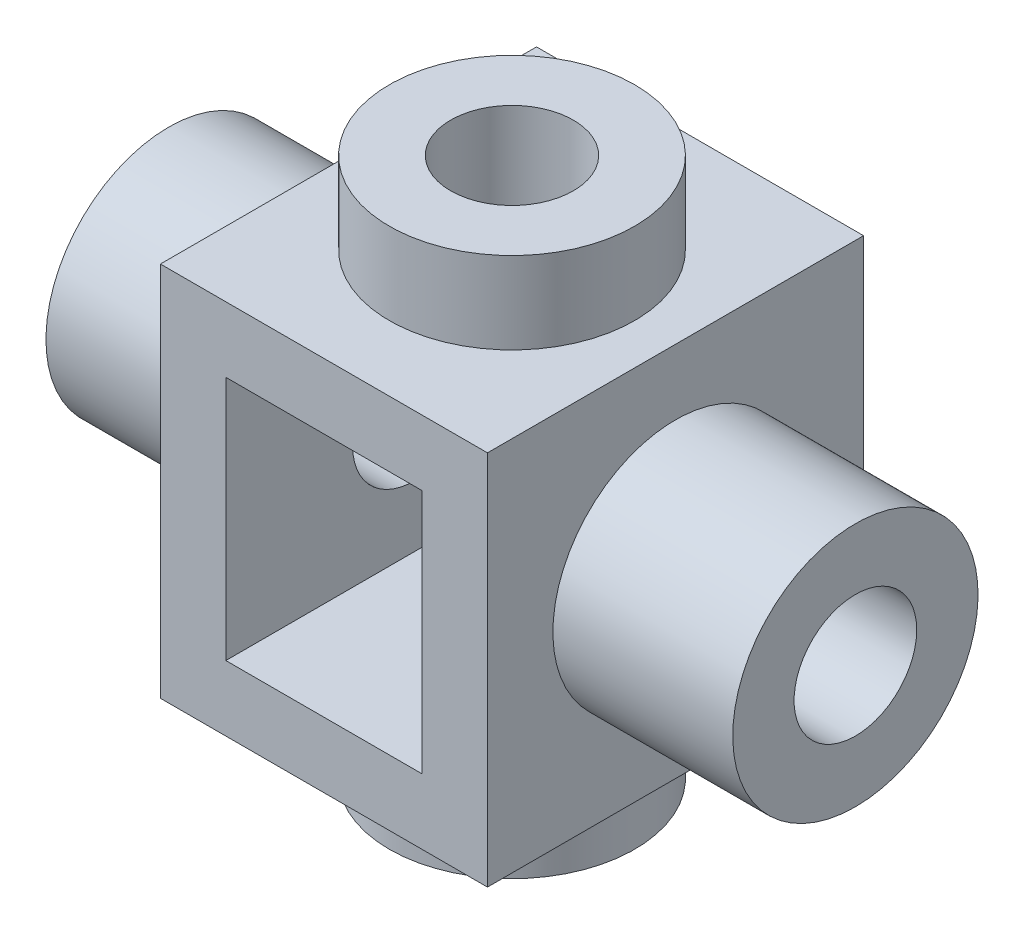
ISO-10303-21;
HEADER;
FILE_DESCRIPTION(('STEP AP214'),'2;1');
FILE_NAME('part.step','',(''),(''),'','','');
FILE_SCHEMA(('AUTOMOTIVE_DESIGN { 1 0 10303 214 1 1 1 1 }'));
ENDSEC;
DATA;
#1=APPLICATION_CONTEXT('core data for automotive mechanical design processes');
#2=APPLICATION_PROTOCOL_DEFINITION('international standard','automotive_design',2000,#1);
#3=PRODUCT_CONTEXT('',#1,'mechanical');
#4=PRODUCT('Part','Part','',(#3));
#5=PRODUCT_RELATED_PRODUCT_CATEGORY('part','',(#4));
#6=PRODUCT_DEFINITION_FORMATION('','',#4);
#7=PRODUCT_DEFINITION_CONTEXT('part definition',#1,'design');
#8=PRODUCT_DEFINITION('design','',#6,#7);
#9=PRODUCT_DEFINITION_SHAPE('','',#8);
#10=(LENGTH_UNIT() NAMED_UNIT(*) SI_UNIT(.MILLI.,.METRE.));
#11=(NAMED_UNIT(*) PLANE_ANGLE_UNIT() SI_UNIT($,.RADIAN.));
#12=(NAMED_UNIT(*) SI_UNIT($,.STERADIAN.) SOLID_ANGLE_UNIT());
#13=UNCERTAINTY_MEASURE_WITH_UNIT(LENGTH_MEASURE(1.E-05),#10,'distance_accuracy_value','');
#14=(GEOMETRIC_REPRESENTATION_CONTEXT(3) GLOBAL_UNCERTAINTY_ASSIGNED_CONTEXT((#13)) GLOBAL_UNIT_ASSIGNED_CONTEXT((#10,
#11,#12)) REPRESENTATION_CONTEXT('',''));
#15=CARTESIAN_POINT('',(0.,0.,0.));
#16=DIRECTION('',(0.,0.,1.));
#17=DIRECTION('',(1.,0.,0.));
#18=AXIS2_PLACEMENT_3D('',#15,#16,#17);
#19=CARTESIAN_POINT('',(20.,-23.,-46.));
#20=DIRECTION('',(0.,-1.,0.));
#21=DIRECTION('',(1.,0.,0.));
#22=AXIS2_PLACEMENT_3D('',#19,#20,#21);
#23=PLANE('',#22);
#24=CARTESIAN_POINT('',(0.,-23.,-23.));
#25=DIRECTION('',(0.,1.,0.));
#26=DIRECTION('',(0.,0.,1.));
#27=AXIS2_PLACEMENT_3D('',#24,#25,#26);
#28=CIRCLE('',#27,15.);
#29=CARTESIAN_POINT('',(0.,-23.,-8.));
#30=VERTEX_POINT('',#29);
#31=EDGE_CURVE('E197',#30,#30,#28,.T.);
#32=ORIENTED_EDGE('',*,*,#31,.T.);
#33=EDGE_LOOP('',(#32));
#34=FACE_BOUND('',#33,.T.);
#35=DIRECTION('',(0.,0.,1.));
#36=VECTOR('',#35,1.);
#37=CARTESIAN_POINT('',(-20.,-23.,-46.));
#38=LINE('',#37,#36);
#39=CARTESIAN_POINT('',(-20.,-23.,-46.));
#40=VERTEX_POINT('',#39);
#41=CARTESIAN_POINT('',(-20.,-23.,0.));
#42=VERTEX_POINT('',#41);
#43=EDGE_CURVE('E136',#40,#42,#38,.T.);
#44=ORIENTED_EDGE('',*,*,#43,.F.);
#45=DIRECTION('',(-1.,0.,0.));
#46=VECTOR('',#45,1.);
#47=CARTESIAN_POINT('',(20.,-23.,-46.));
#48=LINE('',#47,#46);
#49=CARTESIAN_POINT('',(20.,-23.,-46.));
#50=VERTEX_POINT('',#49);
#51=EDGE_CURVE('E11',#50,#40,#48,.T.);
#52=ORIENTED_EDGE('',*,*,#51,.F.);
#53=DIRECTION('',(0.,0.,1.));
#54=VECTOR('',#53,1.);
#55=CARTESIAN_POINT('',(20.,-23.,-46.));
#56=LINE('',#55,#54);
#57=CARTESIAN_POINT('',(20.,-23.,0.));
#58=VERTEX_POINT('',#57);
#59=EDGE_CURVE('E140',#50,#58,#56,.T.);
#60=ORIENTED_EDGE('',*,*,#59,.T.);
#61=DIRECTION('',(-1.,0.,0.));
#62=VECTOR('',#61,1.);
#63=CARTESIAN_POINT('',(20.,-23.,0.));
#64=LINE('',#63,#62);
#65=EDGE_CURVE('E38',#58,#42,#64,.T.);
#66=ORIENTED_EDGE('',*,*,#65,.T.);
#67=EDGE_LOOP('',(#44,#52,#60,#66));
#68=FACE_BOUND('',#67,.T.);
#69=ADVANCED_FACE('F35',(#34,#68),#23,.T.);
#70=CARTESIAN_POINT('',(20.,23.,-46.));
#71=DIRECTION('',(0.,0.,-1.));
#72=DIRECTION('',(-1.,0.,0.));
#73=AXIS2_PLACEMENT_3D('',#70,#71,#72);
#74=PLANE('',#73);
#75=DIRECTION('',(-1.,0.,0.));
#76=VECTOR('',#75,1.);
#77=CARTESIAN_POINT('',(12.,-15.,-46.));
#78=LINE('',#77,#76);
#79=CARTESIAN_POINT('',(12.,-15.,-46.));
#80=VERTEX_POINT('',#79);
#81=CARTESIAN_POINT('',(-12.,-15.,-46.));
#82=VERTEX_POINT('',#81);
#83=EDGE_CURVE('E51',#80,#82,#78,.T.);
#84=ORIENTED_EDGE('',*,*,#83,.F.);
#85=DIRECTION('',(0.,-1.,0.));
#86=VECTOR('',#85,1.);
#87=CARTESIAN_POINT('',(12.,15.,-46.));
#88=LINE('',#87,#86);
#89=CARTESIAN_POINT('',(12.,15.,-46.));
#90=VERTEX_POINT('',#89);
#91=EDGE_CURVE('E118',#90,#80,#88,.T.);
#92=ORIENTED_EDGE('',*,*,#91,.F.);
#93=DIRECTION('',(1.,0.,0.));
#94=VECTOR('',#93,1.);
#95=CARTESIAN_POINT('',(-12.,15.,-46.));
#96=LINE('',#95,#94);
#97=CARTESIAN_POINT('',(-12.,15.,-46.));
#98=VERTEX_POINT('',#97);
#99=EDGE_CURVE('E121',#98,#90,#96,.T.);
#100=ORIENTED_EDGE('',*,*,#99,.F.);
#101=DIRECTION('',(0.,1.,0.));
#102=VECTOR('',#101,1.);
#103=CARTESIAN_POINT('',(-12.,-15.,-46.));
#104=LINE('',#103,#102);
#105=EDGE_CURVE('E130',#82,#98,#104,.T.);
#106=ORIENTED_EDGE('',*,*,#105,.F.);
#107=EDGE_LOOP('',(#84,#92,#100,#106));
#108=FACE_BOUND('',#107,.T.);
#109=DIRECTION('',(0.,-1.,0.));
#110=VECTOR('',#109,1.);
#111=CARTESIAN_POINT('',(-20.,23.,-46.));
#112=LINE('',#111,#110);
#113=CARTESIAN_POINT('',(-20.,23.,-46.));
#114=VERTEX_POINT('',#113);
#115=EDGE_CURVE('E144',#114,#40,#112,.T.);
#116=ORIENTED_EDGE('',*,*,#115,.F.);
#117=DIRECTION('',(-1.,0.,0.));
#118=VECTOR('',#117,1.);
#119=CARTESIAN_POINT('',(20.,23.,-46.));
#120=LINE('',#119,#118);
#121=CARTESIAN_POINT('',(20.,23.,-46.));
#122=VERTEX_POINT('',#121);
#123=EDGE_CURVE('E43',#122,#114,#120,.T.);
#124=ORIENTED_EDGE('',*,*,#123,.F.);
#125=DIRECTION('',(0.,-1.,0.));
#126=VECTOR('',#125,1.);
#127=CARTESIAN_POINT('',(20.,23.,-46.));
#128=LINE('',#127,#126);
#129=EDGE_CURVE('E150',#122,#50,#128,.T.);
#130=ORIENTED_EDGE('',*,*,#129,.T.);
#131=ORIENTED_EDGE('',*,*,#51,.T.);
#132=EDGE_LOOP('',(#116,#124,#130,#131));
#133=FACE_BOUND('',#132,.T.);
#134=ADVANCED_FACE('F174',(#108,#133),#74,.T.);
#135=CARTESIAN_POINT('',(20.,23.,0.));
#136=DIRECTION('',(0.,1.,0.));
#137=DIRECTION('',(-1.,0.,0.));
#138=AXIS2_PLACEMENT_3D('',#135,#136,#137);
#139=PLANE('',#138);
#140=CARTESIAN_POINT('',(0.,23.,-23.));
#141=DIRECTION('',(0.,-1.,0.));
#142=DIRECTION('',(0.,0.,-1.));
#143=AXIS2_PLACEMENT_3D('',#140,#141,#142);
#144=CIRCLE('',#143,15.);
#145=CARTESIAN_POINT('',(0.,23.,-38.));
#146=VERTEX_POINT('',#145);
#147=EDGE_CURVE('E202',#146,#146,#144,.T.);
#148=ORIENTED_EDGE('',*,*,#147,.T.);
#149=EDGE_LOOP('',(#148));
#150=FACE_BOUND('',#149,.T.);
#151=DIRECTION('',(0.,0.,-1.));
#152=VECTOR('',#151,1.);
#153=CARTESIAN_POINT('',(-20.,23.,0.));
#154=LINE('',#153,#152);
#155=CARTESIAN_POINT('',(-20.,23.,0.));
#156=VERTEX_POINT('',#155);
#157=EDGE_CURVE('E158',#156,#114,#154,.T.);
#158=ORIENTED_EDGE('',*,*,#157,.F.);
#159=DIRECTION('',(-1.,0.,0.));
#160=VECTOR('',#159,1.);
#161=CARTESIAN_POINT('',(20.,23.,0.));
#162=LINE('',#161,#160);
#163=CARTESIAN_POINT('',(20.,23.,0.));
#164=VERTEX_POINT('',#163);
#165=EDGE_CURVE('E163',#164,#156,#162,.T.);
#166=ORIENTED_EDGE('',*,*,#165,.F.);
#167=DIRECTION('',(0.,0.,-1.));
#168=VECTOR('',#167,1.);
#169=CARTESIAN_POINT('',(20.,23.,0.));
#170=LINE('',#169,#168);
#171=EDGE_CURVE('E147',#164,#122,#170,.T.);
#172=ORIENTED_EDGE('',*,*,#171,.T.);
#173=ORIENTED_EDGE('',*,*,#123,.T.);
#174=EDGE_LOOP('',(#158,#166,#172,#173));
#175=FACE_BOUND('',#174,.T.);
#176=ADVANCED_FACE('F180',(#150,#175),#139,.T.);
#177=CARTESIAN_POINT('',(20.,-23.,0.));
#178=DIRECTION('',(0.,0.,1.));
#179=DIRECTION('',(1.,0.,0.));
#180=AXIS2_PLACEMENT_3D('',#177,#178,#179);
#181=PLANE('',#180);
#182=DIRECTION('',(-1.,0.,0.));
#183=VECTOR('',#182,1.);
#184=CARTESIAN_POINT('',(12.,-15.,0.));
#185=LINE('',#184,#183);
#186=CARTESIAN_POINT('',(12.,-15.,0.));
#187=VERTEX_POINT('',#186);
#188=CARTESIAN_POINT('',(-12.,-15.,0.));
#189=VERTEX_POINT('',#188);
#190=EDGE_CURVE('E102',#187,#189,#185,.T.);
#191=ORIENTED_EDGE('',*,*,#190,.T.);
#192=DIRECTION('',(0.,1.,0.));
#193=VECTOR('',#192,1.);
#194=CARTESIAN_POINT('',(-12.,-15.,0.));
#195=LINE('',#194,#193);
#196=CARTESIAN_POINT('',(-12.,15.,0.));
#197=VERTEX_POINT('',#196);
#198=EDGE_CURVE('E111',#189,#197,#195,.T.);
#199=ORIENTED_EDGE('',*,*,#198,.T.);
#200=DIRECTION('',(1.,0.,0.));
#201=VECTOR('',#200,1.);
#202=CARTESIAN_POINT('',(-12.,15.,0.));
#203=LINE('',#202,#201);
#204=CARTESIAN_POINT('',(12.,15.,0.));
#205=VERTEX_POINT('',#204);
#206=EDGE_CURVE('E59',#197,#205,#203,.T.);
#207=ORIENTED_EDGE('',*,*,#206,.T.);
#208=DIRECTION('',(0.,-1.,0.));
#209=VECTOR('',#208,1.);
#210=CARTESIAN_POINT('',(12.,15.,0.));
#211=LINE('',#210,#209);
#212=EDGE_CURVE('E108',#205,#187,#211,.T.);
#213=ORIENTED_EDGE('',*,*,#212,.T.);
#214=EDGE_LOOP('',(#191,#199,#207,#213));
#215=FACE_BOUND('',#214,.T.);
#216=DIRECTION('',(0.,1.,0.));
#217=VECTOR('',#216,1.);
#218=CARTESIAN_POINT('',(-20.,-23.,0.));
#219=LINE('',#218,#217);
#220=EDGE_CURVE('E155',#42,#156,#219,.T.);
#221=ORIENTED_EDGE('',*,*,#220,.F.);
#222=ORIENTED_EDGE('',*,*,#65,.F.);
#223=DIRECTION('',(0.,1.,0.));
#224=VECTOR('',#223,1.);
#225=CARTESIAN_POINT('',(20.,-23.,0.));
#226=LINE('',#225,#224);
#227=EDGE_CURVE('E143',#58,#164,#226,.T.);
#228=ORIENTED_EDGE('',*,*,#227,.T.);
#229=ORIENTED_EDGE('',*,*,#165,.T.);
#230=EDGE_LOOP('',(#221,#222,#228,#229));
#231=FACE_BOUND('',#230,.T.);
#232=ADVANCED_FACE('F115',(#215,#231),#181,.T.);
#233=CARTESIAN_POINT('',(20.,0.,0.));
#234=DIRECTION('',(-1.,0.,0.));
#235=DIRECTION('',(0.,-1.,0.));
#236=AXIS2_PLACEMENT_3D('',#233,#234,#235);
#237=PLANE('',#236);
#238=CARTESIAN_POINT('',(20.,0.,-23.));
#239=DIRECTION('',(-1.,0.,0.));
#240=DIRECTION('',(0.,-1.,0.));
#241=AXIS2_PLACEMENT_3D('',#238,#239,#240);
#242=CIRCLE('',#241,15.);
#243=CARTESIAN_POINT('',(20.,-15.,-23.));
#244=VERTEX_POINT('',#243);
#245=EDGE_CURVE('E215',#244,#244,#242,.T.);
#246=ORIENTED_EDGE('',*,*,#245,.T.);
#247=EDGE_LOOP('',(#246));
#248=FACE_BOUND('',#247,.T.);
#249=ORIENTED_EDGE('',*,*,#59,.F.);
#250=ORIENTED_EDGE('',*,*,#129,.F.);
#251=ORIENTED_EDGE('',*,*,#171,.F.);
#252=ORIENTED_EDGE('',*,*,#227,.F.);
#253=EDGE_LOOP('',(#249,#250,#251,#252));
#254=FACE_BOUND('',#253,.T.);
#255=ADVANCED_FACE('F177',(#248,#254),#237,.F.);
#256=CARTESIAN_POINT('',(-20.,0.,0.));
#257=DIRECTION('',(-1.,0.,0.));
#258=DIRECTION('',(0.,-1.,0.));
#259=AXIS2_PLACEMENT_3D('',#256,#257,#258);
#260=PLANE('',#259);
#261=CARTESIAN_POINT('',(-20.,0.,-23.));
#262=DIRECTION('',(1.,0.,0.));
#263=DIRECTION('',(0.,1.,0.));
#264=AXIS2_PLACEMENT_3D('',#261,#262,#263);
#265=CIRCLE('',#264,15.);
#266=CARTESIAN_POINT('',(-20.,15.,-23.));
#267=VERTEX_POINT('',#266);
#268=EDGE_CURVE('E209',#267,#267,#265,.T.);
#269=ORIENTED_EDGE('',*,*,#268,.T.);
#270=EDGE_LOOP('',(#269));
#271=FACE_BOUND('',#270,.T.);
#272=ORIENTED_EDGE('',*,*,#43,.T.);
#273=ORIENTED_EDGE('',*,*,#220,.T.);
#274=ORIENTED_EDGE('',*,*,#157,.T.);
#275=ORIENTED_EDGE('',*,*,#115,.T.);
#276=EDGE_LOOP('',(#272,#273,#274,#275));
#277=FACE_BOUND('',#276,.T.);
#278=ADVANCED_FACE('F171',(#271,#277),#260,.T.);
#279=CARTESIAN_POINT('',(12.,-15.,0.));
#280=DIRECTION('',(0.,-1.,0.));
#281=DIRECTION('',(0.,0.,-1.));
#282=AXIS2_PLACEMENT_3D('',#279,#280,#281);
#283=PLANE('',#282);
#284=CARTESIAN_POINT('',(0.,-15.,-23.));
#285=DIRECTION('',(0.,-1.,0.));
#286=DIRECTION('',(0.,0.,-1.));
#287=AXIS2_PLACEMENT_3D('',#284,#285,#286);
#288=CIRCLE('',#287,7.49999999999999);
#289=CARTESIAN_POINT('',(0.,-15.,-30.5));
#290=VERTEX_POINT('',#289);
#291=EDGE_CURVE('E218',#290,#290,#288,.T.);
#292=ORIENTED_EDGE('',*,*,#291,.T.);
#293=EDGE_LOOP('',(#292));
#294=FACE_BOUND('',#293,.T.);
#295=ORIENTED_EDGE('',*,*,#83,.T.);
#296=DIRECTION('',(0.,0.,-1.));
#297=VECTOR('',#296,1.);
#298=CARTESIAN_POINT('',(-12.,-15.,0.));
#299=LINE('',#298,#297);
#300=EDGE_CURVE('E98',#189,#82,#299,.T.);
#301=ORIENTED_EDGE('',*,*,#300,.F.);
#302=ORIENTED_EDGE('',*,*,#190,.F.);
#303=DIRECTION('',(0.,0.,-1.));
#304=VECTOR('',#303,1.);
#305=CARTESIAN_POINT('',(12.,-15.,0.));
#306=LINE('',#305,#304);
#307=EDGE_CURVE('E134',#187,#80,#306,.T.);
#308=ORIENTED_EDGE('',*,*,#307,.T.);
#309=EDGE_LOOP('',(#295,#301,#302,#308));
#310=FACE_BOUND('',#309,.T.);
#311=ADVANCED_FACE('F100',(#294,#310),#283,.F.);
#312=CARTESIAN_POINT('',(12.,15.,0.));
#313=DIRECTION('',(1.,0.,0.));
#314=DIRECTION('',(0.,0.,-1.));
#315=AXIS2_PLACEMENT_3D('',#312,#313,#314);
#316=PLANE('',#315);
#317=CARTESIAN_POINT('',(12.,0.,-23.));
#318=DIRECTION('',(1.,0.,0.));
#319=DIRECTION('',(0.,0.,-1.));
#320=AXIS2_PLACEMENT_3D('',#317,#318,#319);
#321=CIRCLE('',#320,7.49999999999998);
#322=CARTESIAN_POINT('',(12.,0.,-30.5));
#323=VERTEX_POINT('',#322);
#324=EDGE_CURVE('E236',#323,#323,#321,.T.);
#325=ORIENTED_EDGE('',*,*,#324,.T.);
#326=EDGE_LOOP('',(#325));
#327=FACE_BOUND('',#326,.T.);
#328=ORIENTED_EDGE('',*,*,#91,.T.);
#329=ORIENTED_EDGE('',*,*,#307,.F.);
#330=ORIENTED_EDGE('',*,*,#212,.F.);
#331=DIRECTION('',(0.,0.,-1.));
#332=VECTOR('',#331,1.);
#333=CARTESIAN_POINT('',(12.,15.,0.));
#334=LINE('',#333,#332);
#335=EDGE_CURVE('E137',#205,#90,#334,.T.);
#336=ORIENTED_EDGE('',*,*,#335,.T.);
#337=EDGE_LOOP('',(#328,#329,#330,#336));
#338=FACE_BOUND('',#337,.T.);
#339=ADVANCED_FACE('F270',(#327,#338),#316,.F.);
#340=CARTESIAN_POINT('',(-12.,15.,0.));
#341=DIRECTION('',(0.,1.,0.));
#342=DIRECTION('',(0.,0.,1.));
#343=AXIS2_PLACEMENT_3D('',#340,#341,#342);
#344=PLANE('',#343);
#345=CARTESIAN_POINT('',(0.,15.,-23.));
#346=DIRECTION('',(0.,1.,0.));
#347=DIRECTION('',(0.,0.,1.));
#348=AXIS2_PLACEMENT_3D('',#345,#346,#347);
#349=CIRCLE('',#348,7.49999999999998);
#350=CARTESIAN_POINT('',(0.,15.,-15.5));
#351=VERTEX_POINT('',#350);
#352=EDGE_CURVE('E224',#351,#351,#349,.T.);
#353=ORIENTED_EDGE('',*,*,#352,.T.);
#354=EDGE_LOOP('',(#353));
#355=FACE_BOUND('',#354,.T.);
#356=ORIENTED_EDGE('',*,*,#99,.T.);
#357=ORIENTED_EDGE('',*,*,#335,.F.);
#358=ORIENTED_EDGE('',*,*,#206,.F.);
#359=DIRECTION('',(0.,0.,-1.));
#360=VECTOR('',#359,1.);
#361=CARTESIAN_POINT('',(-12.,15.,0.));
#362=LINE('',#361,#360);
#363=EDGE_CURVE('E107',#197,#98,#362,.T.);
#364=ORIENTED_EDGE('',*,*,#363,.T.);
#365=EDGE_LOOP('',(#356,#357,#358,#364));
#366=FACE_BOUND('',#365,.T.);
#367=ADVANCED_FACE('F275',(#355,#366),#344,.F.);
#368=CARTESIAN_POINT('',(-12.,-15.,0.));
#369=DIRECTION('',(-1.,0.,0.));
#370=DIRECTION('',(0.,0.,1.));
#371=AXIS2_PLACEMENT_3D('',#368,#369,#370);
#372=PLANE('',#371);
#373=CARTESIAN_POINT('',(-12.,0.,-23.));
#374=DIRECTION('',(-1.,0.,0.));
#375=DIRECTION('',(0.,0.,1.));
#376=AXIS2_PLACEMENT_3D('',#373,#374,#375);
#377=CIRCLE('',#376,7.49999999999999);
#378=CARTESIAN_POINT('',(-12.,0.,-15.5));
#379=VERTEX_POINT('',#378);
#380=EDGE_CURVE('E230',#379,#379,#377,.T.);
#381=ORIENTED_EDGE('',*,*,#380,.T.);
#382=EDGE_LOOP('',(#381));
#383=FACE_BOUND('',#382,.T.);
#384=ORIENTED_EDGE('',*,*,#105,.T.);
#385=ORIENTED_EDGE('',*,*,#363,.F.);
#386=ORIENTED_EDGE('',*,*,#198,.F.);
#387=ORIENTED_EDGE('',*,*,#300,.T.);
#388=EDGE_LOOP('',(#384,#385,#386,#387));
#389=FACE_BOUND('',#388,.T.);
#390=ADVANCED_FACE('F112',(#383,#389),#372,.F.);
#391=CARTESIAN_POINT('',(0.,-33.,-23.));
#392=DIRECTION('',(0.,1.,0.));
#393=DIRECTION('',(0.,0.,1.));
#394=AXIS2_PLACEMENT_3D('',#391,#392,#393);
#395=CYLINDRICAL_SURFACE('',#394,15.);
#396=CARTESIAN_POINT('',(0.,-33.,-23.));
#397=DIRECTION('',(0.,1.,0.));
#398=DIRECTION('',(0.,0.,1.));
#399=AXIS2_PLACEMENT_3D('',#396,#397,#398);
#400=CIRCLE('',#399,15.);
#401=CARTESIAN_POINT('',(0.,-33.,-8.));
#402=VERTEX_POINT('',#401);
#403=EDGE_CURVE('E124',#402,#402,#400,.T.);
#404=ORIENTED_EDGE('',*,*,#403,.T.);
#405=EDGE_LOOP('',(#404));
#406=FACE_BOUND('',#405,.T.);
#407=ORIENTED_EDGE('',*,*,#31,.F.);
#408=EDGE_LOOP('',(#407));
#409=FACE_BOUND('',#408,.T.);
#410=ADVANCED_FACE('F274',(#406,#409),#395,.T.);
#411=CARTESIAN_POINT('',(15.,-33.,-23.));
#412=DIRECTION('',(0.,-1.,0.));
#413=DIRECTION('',(0.,0.,-1.));
#414=AXIS2_PLACEMENT_3D('',#411,#412,#413);
#415=PLANE('',#414);
#416=CARTESIAN_POINT('',(0.,-33.,-23.));
#417=DIRECTION('',(0.,-1.,0.));
#418=DIRECTION('',(0.,0.,-1.));
#419=AXIS2_PLACEMENT_3D('',#416,#417,#418);
#420=CIRCLE('',#419,7.49999999999999);
#421=CARTESIAN_POINT('',(0.,-33.,-30.5));
#422=VERTEX_POINT('',#421);
#423=EDGE_CURVE('E221',#422,#422,#420,.T.);
#424=ORIENTED_EDGE('',*,*,#423,.F.);
#425=EDGE_LOOP('',(#424));
#426=FACE_BOUND('',#425,.T.);
#427=ORIENTED_EDGE('',*,*,#403,.F.);
#428=EDGE_LOOP('',(#427));
#429=FACE_BOUND('',#428,.T.);
#430=ADVANCED_FACE('F285',(#426,#429),#415,.T.);
#431=CARTESIAN_POINT('',(0.,33.,-23.));
#432=DIRECTION('',(0.,-1.,0.));
#433=DIRECTION('',(0.,0.,-1.));
#434=AXIS2_PLACEMENT_3D('',#431,#432,#433);
#435=CYLINDRICAL_SURFACE('',#434,15.);
#436=CARTESIAN_POINT('',(0.,33.,-23.));
#437=DIRECTION('',(0.,-1.,0.));
#438=DIRECTION('',(0.,0.,-1.));
#439=AXIS2_PLACEMENT_3D('',#436,#437,#438);
#440=CIRCLE('',#439,15.);
#441=CARTESIAN_POINT('',(0.,33.,-38.));
#442=VERTEX_POINT('',#441);
#443=EDGE_CURVE('E199',#442,#442,#440,.T.);
#444=ORIENTED_EDGE('',*,*,#443,.T.);
#445=EDGE_LOOP('',(#444));
#446=FACE_BOUND('',#445,.T.);
#447=ORIENTED_EDGE('',*,*,#147,.F.);
#448=EDGE_LOOP('',(#447));
#449=FACE_BOUND('',#448,.T.);
#450=ADVANCED_FACE('F289',(#446,#449),#435,.T.);
#451=CARTESIAN_POINT('',(15.,33.,-23.));
#452=DIRECTION('',(0.,1.,0.));
#453=DIRECTION('',(0.,0.,1.));
#454=AXIS2_PLACEMENT_3D('',#451,#452,#453);
#455=PLANE('',#454);
#456=CARTESIAN_POINT('',(0.,33.,-23.));
#457=DIRECTION('',(0.,1.,0.));
#458=DIRECTION('',(0.,0.,1.));
#459=AXIS2_PLACEMENT_3D('',#456,#457,#458);
#460=CIRCLE('',#459,7.49999999999999);
#461=CARTESIAN_POINT('',(0.,33.,-15.5));
#462=VERTEX_POINT('',#461);
#463=EDGE_CURVE('E227',#462,#462,#460,.T.);
#464=ORIENTED_EDGE('',*,*,#463,.F.);
#465=EDGE_LOOP('',(#464));
#466=FACE_BOUND('',#465,.T.);
#467=ORIENTED_EDGE('',*,*,#443,.F.);
#468=EDGE_LOOP('',(#467));
#469=FACE_BOUND('',#468,.T.);
#470=ADVANCED_FACE('F293',(#466,#469),#455,.T.);
#471=CARTESIAN_POINT('',(-42.,0.,-23.));
#472=DIRECTION('',(1.,0.,0.));
#473=DIRECTION('',(0.,1.,0.));
#474=AXIS2_PLACEMENT_3D('',#471,#472,#473);
#475=CYLINDRICAL_SURFACE('',#474,15.);
#476=CARTESIAN_POINT('',(-42.,0.,-23.));
#477=DIRECTION('',(1.,0.,0.));
#478=DIRECTION('',(0.,1.,0.));
#479=AXIS2_PLACEMENT_3D('',#476,#477,#478);
#480=CIRCLE('',#479,15.);
#481=CARTESIAN_POINT('',(-42.,15.,-23.));
#482=VERTEX_POINT('',#481);
#483=EDGE_CURVE('E206',#482,#482,#480,.T.);
#484=ORIENTED_EDGE('',*,*,#483,.T.);
#485=EDGE_LOOP('',(#484));
#486=FACE_BOUND('',#485,.T.);
#487=ORIENTED_EDGE('',*,*,#268,.F.);
#488=EDGE_LOOP('',(#487));
#489=FACE_BOUND('',#488,.T.);
#490=ADVANCED_FACE('F297',(#486,#489),#475,.T.);
#491=CARTESIAN_POINT('',(-42.,15.,-23.));
#492=DIRECTION('',(-1.,0.,0.));
#493=DIRECTION('',(0.,-1.,0.));
#494=AXIS2_PLACEMENT_3D('',#491,#492,#493);
#495=PLANE('',#494);
#496=CARTESIAN_POINT('',(-42.,0.,-23.));
#497=DIRECTION('',(-1.,0.,0.));
#498=DIRECTION('',(0.,0.,1.));
#499=AXIS2_PLACEMENT_3D('',#496,#497,#498);
#500=CIRCLE('',#499,7.49999999999998);
#501=CARTESIAN_POINT('',(-42.,0.,-15.5));
#502=VERTEX_POINT('',#501);
#503=EDGE_CURVE('E233',#502,#502,#500,.T.);
#504=ORIENTED_EDGE('',*,*,#503,.F.);
#505=EDGE_LOOP('',(#504));
#506=FACE_BOUND('',#505,.T.);
#507=ORIENTED_EDGE('',*,*,#483,.F.);
#508=EDGE_LOOP('',(#507));
#509=FACE_BOUND('',#508,.T.);
#510=ADVANCED_FACE('F256',(#506,#509),#495,.T.);
#511=CARTESIAN_POINT('',(42.,0.,-23.));
#512=DIRECTION('',(-1.,0.,0.));
#513=DIRECTION('',(0.,-1.,0.));
#514=AXIS2_PLACEMENT_3D('',#511,#512,#513);
#515=CYLINDRICAL_SURFACE('',#514,15.);
#516=CARTESIAN_POINT('',(42.,0.,-23.));
#517=DIRECTION('',(-1.,0.,0.));
#518=DIRECTION('',(0.,-1.,0.));
#519=AXIS2_PLACEMENT_3D('',#516,#517,#518);
#520=CIRCLE('',#519,15.);
#521=CARTESIAN_POINT('',(42.,-15.,-23.));
#522=VERTEX_POINT('',#521);
#523=EDGE_CURVE('E212',#522,#522,#520,.T.);
#524=ORIENTED_EDGE('',*,*,#523,.T.);
#525=EDGE_LOOP('',(#524));
#526=FACE_BOUND('',#525,.T.);
#527=ORIENTED_EDGE('',*,*,#245,.F.);
#528=EDGE_LOOP('',(#527));
#529=FACE_BOUND('',#528,.T.);
#530=ADVANCED_FACE('F250',(#526,#529),#515,.T.);
#531=CARTESIAN_POINT('',(42.,15.,-23.));
#532=DIRECTION('',(1.,0.,0.));
#533=DIRECTION('',(0.,1.,0.));
#534=AXIS2_PLACEMENT_3D('',#531,#532,#533);
#535=PLANE('',#534);
#536=CARTESIAN_POINT('',(42.,0.,-23.));
#537=DIRECTION('',(1.,0.,0.));
#538=DIRECTION('',(0.,0.,-1.));
#539=AXIS2_PLACEMENT_3D('',#536,#537,#538);
#540=CIRCLE('',#539,7.49999999999998);
#541=CARTESIAN_POINT('',(42.,0.,-30.5));
#542=VERTEX_POINT('',#541);
#543=EDGE_CURVE('E239',#542,#542,#540,.T.);
#544=ORIENTED_EDGE('',*,*,#543,.F.);
#545=EDGE_LOOP('',(#544));
#546=FACE_BOUND('',#545,.T.);
#547=ORIENTED_EDGE('',*,*,#523,.F.);
#548=EDGE_LOOP('',(#547));
#549=FACE_BOUND('',#548,.T.);
#550=ADVANCED_FACE('F246',(#546,#549),#535,.T.);
#551=CARTESIAN_POINT('',(0.,-33.,-23.));
#552=DIRECTION('',(0.,-1.,0.));
#553=DIRECTION('',(0.,0.,-1.));
#554=AXIS2_PLACEMENT_3D('',#551,#552,#553);
#555=CYLINDRICAL_SURFACE('',#554,7.49999999999999);
#556=ORIENTED_EDGE('',*,*,#291,.F.);
#557=EDGE_LOOP('',(#556));
#558=FACE_BOUND('',#557,.T.);
#559=ORIENTED_EDGE('',*,*,#423,.T.);
#560=EDGE_LOOP('',(#559));
#561=FACE_BOUND('',#560,.T.);
#562=ADVANCED_FACE('F249',(#558,#561),#555,.F.);
#563=CARTESIAN_POINT('',(0.,33.,-23.));
#564=DIRECTION('',(0.,1.,0.));
#565=DIRECTION('',(0.,0.,1.));
#566=AXIS2_PLACEMENT_3D('',#563,#564,#565);
#567=CYLINDRICAL_SURFACE('',#566,7.49999999999998);
#568=ORIENTED_EDGE('',*,*,#463,.T.);
#569=EDGE_LOOP('',(#568));
#570=FACE_BOUND('',#569,.T.);
#571=ORIENTED_EDGE('',*,*,#352,.F.);
#572=EDGE_LOOP('',(#571));
#573=FACE_BOUND('',#572,.T.);
#574=ADVANCED_FACE('F307',(#570,#573),#567,.F.);
#575=CARTESIAN_POINT('',(-42.,0.,-23.));
#576=DIRECTION('',(-1.,0.,0.));
#577=DIRECTION('',(0.,0.,1.));
#578=AXIS2_PLACEMENT_3D('',#575,#576,#577);
#579=CYLINDRICAL_SURFACE('',#578,7.49999999999999);
#580=ORIENTED_EDGE('',*,*,#380,.F.);
#581=EDGE_LOOP('',(#580));
#582=FACE_BOUND('',#581,.T.);
#583=ORIENTED_EDGE('',*,*,#503,.T.);
#584=EDGE_LOOP('',(#583));
#585=FACE_BOUND('',#584,.T.);
#586=ADVANCED_FACE('F311',(#582,#585),#579,.F.);
#587=CARTESIAN_POINT('',(42.,0.,-23.));
#588=DIRECTION('',(1.,0.,0.));
#589=DIRECTION('',(0.,0.,-1.));
#590=AXIS2_PLACEMENT_3D('',#587,#588,#589);
#591=CYLINDRICAL_SURFACE('',#590,7.49999999999998);
#592=ORIENTED_EDGE('',*,*,#543,.T.);
#593=EDGE_LOOP('',(#592));
#594=FACE_BOUND('',#593,.T.);
#595=ORIENTED_EDGE('',*,*,#324,.F.);
#596=EDGE_LOOP('',(#595));
#597=FACE_BOUND('',#596,.T.);
#598=ADVANCED_FACE('F243',(#594,#597),#591,.F.);
#599=CLOSED_SHELL('',(#69,#134,#176,#232,#255,#278,#311,#339,#367,#390,#410,#430,#450,#470,#490,
#510,#530,#550,#562,#574,#586,#598));
#600=MANIFOLD_SOLID_BREP('B2',#599);
#601=ADVANCED_BREP_SHAPE_REPRESENTATION('',(#18,#600),#14);
#602=SHAPE_DEFINITION_REPRESENTATION(#9,#601);
ENDSEC;
END-ISO-10303-21;
